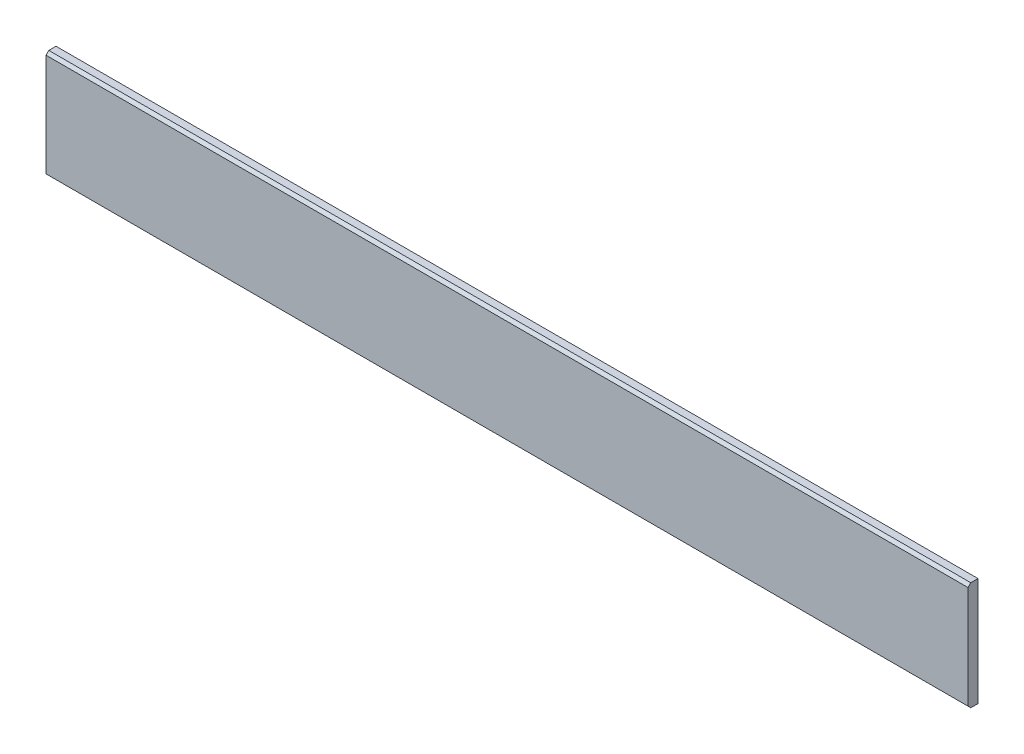
ISO-10303-21;
HEADER;
FILE_DESCRIPTION(('STEP AP214'),'2;1');
FILE_NAME('part.step','',(''),(''),'','','');
FILE_SCHEMA(('AUTOMOTIVE_DESIGN { 1 0 10303 214 1 1 1 1 }'));
ENDSEC;
DATA;
#1=APPLICATION_CONTEXT('core data for automotive mechanical design processes');
#2=APPLICATION_PROTOCOL_DEFINITION('international standard','automotive_design',2000,#1);
#3=PRODUCT_CONTEXT('',#1,'mechanical');
#4=PRODUCT('Part','Part','',(#3));
#5=PRODUCT_RELATED_PRODUCT_CATEGORY('part','',(#4));
#6=PRODUCT_DEFINITION_FORMATION('','',#4);
#7=PRODUCT_DEFINITION_CONTEXT('part definition',#1,'design');
#8=PRODUCT_DEFINITION('design','',#6,#7);
#9=PRODUCT_DEFINITION_SHAPE('','',#8);
#10=(LENGTH_UNIT() NAMED_UNIT(*) SI_UNIT(.MILLI.,.METRE.));
#11=(NAMED_UNIT(*) PLANE_ANGLE_UNIT() SI_UNIT($,.RADIAN.));
#12=(NAMED_UNIT(*) SI_UNIT($,.STERADIAN.) SOLID_ANGLE_UNIT());
#13=UNCERTAINTY_MEASURE_WITH_UNIT(LENGTH_MEASURE(1.E-05),#10,'distance_accuracy_value','');
#14=(GEOMETRIC_REPRESENTATION_CONTEXT(3) GLOBAL_UNCERTAINTY_ASSIGNED_CONTEXT((#13)) GLOBAL_UNIT_ASSIGNED_CONTEXT((#10,
#11,#12)) REPRESENTATION_CONTEXT('',''));
#15=CARTESIAN_POINT('',(0.,0.,0.));
#16=DIRECTION('',(0.,0.,1.));
#17=DIRECTION('',(1.,0.,0.));
#18=AXIS2_PLACEMENT_3D('',#15,#16,#17);
#19=CARTESIAN_POINT('',(830.,97.5,18.));
#20=DIRECTION('',(-1.,0.,0.));
#21=DIRECTION('',(0.,-1.,0.));
#22=AXIS2_PLACEMENT_3D('',#19,#20,#21);
#23=PLANE('',#22);
#24=DIRECTION('',(0.,1.,0.));
#25=VECTOR('',#24,1.);
#26=CARTESIAN_POINT('',(830.,97.5,18.));
#27=LINE('',#26,#25);
#28=CARTESIAN_POINT('',(830.,-92.4999999999999,18.));
#29=VERTEX_POINT('',#28);
#30=CARTESIAN_POINT('',(830.,92.4999999999999,18.));
#31=VERTEX_POINT('',#30);
#32=EDGE_CURVE('E119',#29,#31,#27,.T.);
#33=ORIENTED_EDGE('',*,*,#32,.F.);
#34=DIRECTION('',(0.,-0.707106781186548,-0.707106781186548));
#35=VECTOR('',#34,1.);
#36=CARTESIAN_POINT('',(830.,-92.5000000000001,17.9999999999998));
#37=LINE('',#36,#35);
#38=CARTESIAN_POINT('',(830.,-97.5,12.9999999999999));
#39=VERTEX_POINT('',#38);
#40=EDGE_CURVE('E131',#29,#39,#37,.T.);
#41=ORIENTED_EDGE('',*,*,#40,.T.);
#42=DIRECTION('',(0.,0.,-1.));
#43=VECTOR('',#42,1.);
#44=CARTESIAN_POINT('',(830.,-97.5,18.));
#45=LINE('',#44,#43);
#46=CARTESIAN_POINT('',(830.,-97.5,0.));
#47=VERTEX_POINT('',#46);
#48=EDGE_CURVE('E109',#39,#47,#45,.T.);
#49=ORIENTED_EDGE('',*,*,#48,.T.);
#50=DIRECTION('',(0.,1.,0.));
#51=VECTOR('',#50,1.);
#52=CARTESIAN_POINT('',(830.,97.5,0.));
#53=LINE('',#52,#51);
#54=CARTESIAN_POINT('',(830.,97.5,0.));
#55=VERTEX_POINT('',#54);
#56=EDGE_CURVE('E104',#47,#55,#53,.T.);
#57=ORIENTED_EDGE('',*,*,#56,.T.);
#58=DIRECTION('',(0.,0.,-1.));
#59=VECTOR('',#58,1.);
#60=CARTESIAN_POINT('',(830.,97.5,18.));
#61=LINE('',#60,#59);
#62=CARTESIAN_POINT('',(830.,97.5,12.9999999999999));
#63=VERTEX_POINT('',#62);
#64=EDGE_CURVE('E88',#63,#55,#61,.T.);
#65=ORIENTED_EDGE('',*,*,#64,.F.);
#66=DIRECTION('',(0.,-0.707106781186548,0.707106781186548));
#67=VECTOR('',#66,1.);
#68=CARTESIAN_POINT('',(830.,92.4999999999997,18.0000000000002));
#69=LINE('',#68,#67);
#70=EDGE_CURVE('E129',#63,#31,#69,.T.);
#71=ORIENTED_EDGE('',*,*,#70,.T.);
#72=EDGE_LOOP('',(#33,#41,#49,#57,#65,#71));
#73=FACE_BOUND('',#72,.T.);
#74=ADVANCED_FACE('F35',(#73),#23,.F.);
#75=CARTESIAN_POINT('',(-830.,97.5,18.));
#76=DIRECTION('',(0.,-1.,0.));
#77=DIRECTION('',(0.,0.,-1.));
#78=AXIS2_PLACEMENT_3D('',#75,#76,#77);
#79=PLANE('',#78);
#80=DIRECTION('',(0.,0.,-1.));
#81=VECTOR('',#80,1.);
#82=CARTESIAN_POINT('',(-830.,97.5,18.));
#83=LINE('',#82,#81);
#84=CARTESIAN_POINT('',(-830.,97.5,12.9999999999999));
#85=VERTEX_POINT('',#84);
#86=CARTESIAN_POINT('',(-830.,97.5,0.));
#87=VERTEX_POINT('',#86);
#88=EDGE_CURVE('E98',#85,#87,#83,.T.);
#89=ORIENTED_EDGE('',*,*,#88,.F.);
#90=DIRECTION('',(1.,0.,0.));
#91=VECTOR('',#90,1.);
#92=CARTESIAN_POINT('',(830.,97.5,12.9999999999999));
#93=LINE('',#92,#91);
#94=EDGE_CURVE('E11',#85,#63,#93,.T.);
#95=ORIENTED_EDGE('',*,*,#94,.T.);
#96=ORIENTED_EDGE('',*,*,#64,.T.);
#97=DIRECTION('',(-1.,0.,0.));
#98=VECTOR('',#97,1.);
#99=CARTESIAN_POINT('',(-830.,97.5,0.));
#100=LINE('',#99,#98);
#101=EDGE_CURVE('E91',#55,#87,#100,.T.);
#102=ORIENTED_EDGE('',*,*,#101,.T.);
#103=EDGE_LOOP('',(#89,#95,#96,#102));
#104=FACE_BOUND('',#103,.T.);
#105=ADVANCED_FACE('F90',(#104),#79,.F.);
#106=CARTESIAN_POINT('',(-830.,97.5,18.));
#107=DIRECTION('',(1.,0.,0.));
#108=DIRECTION('',(0.,1.,0.));
#109=AXIS2_PLACEMENT_3D('',#106,#107,#108);
#110=PLANE('',#109);
#111=DIRECTION('',(0.,0.,-1.));
#112=VECTOR('',#111,1.);
#113=CARTESIAN_POINT('',(-830.,-97.5,18.));
#114=LINE('',#113,#112);
#115=CARTESIAN_POINT('',(-830.,-97.5,12.9999999999999));
#116=VERTEX_POINT('',#115);
#117=CARTESIAN_POINT('',(-830.,-97.5,0.));
#118=VERTEX_POINT('',#117);
#119=EDGE_CURVE('E121',#116,#118,#114,.T.);
#120=ORIENTED_EDGE('',*,*,#119,.F.);
#121=DIRECTION('',(0.,0.707106781186548,0.707106781186548));
#122=VECTOR('',#121,1.);
#123=CARTESIAN_POINT('',(-830.,-92.4999999999996,18.0000000000002));
#124=LINE('',#123,#122);
#125=CARTESIAN_POINT('',(-830.,-92.4999999999999,18.));
#126=VERTEX_POINT('',#125);
#127=EDGE_CURVE('E43',#116,#126,#124,.T.);
#128=ORIENTED_EDGE('',*,*,#127,.T.);
#129=DIRECTION('',(0.,-1.,0.));
#130=VECTOR('',#129,1.);
#131=CARTESIAN_POINT('',(-830.,97.5,18.));
#132=LINE('',#131,#130);
#133=CARTESIAN_POINT('',(-830.,92.4999999999999,18.));
#134=VERTEX_POINT('',#133);
#135=EDGE_CURVE('E113',#134,#126,#132,.T.);
#136=ORIENTED_EDGE('',*,*,#135,.F.);
#137=DIRECTION('',(0.,0.707106781186548,-0.707106781186548));
#138=VECTOR('',#137,1.);
#139=CARTESIAN_POINT('',(-830.,92.5000000000001,17.9999999999998));
#140=LINE('',#139,#138);
#141=EDGE_CURVE('E50',#134,#85,#140,.T.);
#142=ORIENTED_EDGE('',*,*,#141,.T.);
#143=ORIENTED_EDGE('',*,*,#88,.T.);
#144=DIRECTION('',(0.,-1.,0.));
#145=VECTOR('',#144,1.);
#146=CARTESIAN_POINT('',(-830.,97.5,0.));
#147=LINE('',#146,#145);
#148=EDGE_CURVE('E106',#87,#118,#147,.T.);
#149=ORIENTED_EDGE('',*,*,#148,.T.);
#150=EDGE_LOOP('',(#120,#128,#136,#142,#143,#149));
#151=FACE_BOUND('',#150,.T.);
#152=ADVANCED_FACE('F136',(#151),#110,.F.);
#153=CARTESIAN_POINT('',(-830.,-97.5,18.));
#154=DIRECTION('',(0.,1.,0.));
#155=DIRECTION('',(0.,0.,1.));
#156=AXIS2_PLACEMENT_3D('',#153,#154,#155);
#157=PLANE('',#156);
#158=ORIENTED_EDGE('',*,*,#48,.F.);
#159=DIRECTION('',(-1.,0.,0.));
#160=VECTOR('',#159,1.);
#161=CARTESIAN_POINT('',(-830.,-97.5,12.9999999999999));
#162=LINE('',#161,#160);
#163=EDGE_CURVE('E58',#39,#116,#162,.T.);
#164=ORIENTED_EDGE('',*,*,#163,.T.);
#165=ORIENTED_EDGE('',*,*,#119,.T.);
#166=DIRECTION('',(1.,0.,0.));
#167=VECTOR('',#166,1.);
#168=CARTESIAN_POINT('',(-830.,-97.5,0.));
#169=LINE('',#168,#167);
#170=EDGE_CURVE('E117',#118,#47,#169,.T.);
#171=ORIENTED_EDGE('',*,*,#170,.T.);
#172=EDGE_LOOP('',(#158,#164,#165,#171));
#173=FACE_BOUND('',#172,.T.);
#174=ADVANCED_FACE('F144',(#173),#157,.F.);
#175=CARTESIAN_POINT('',(0.,0.,18.));
#176=DIRECTION('',(0.,0.,1.));
#177=DIRECTION('',(1.,0.,0.));
#178=AXIS2_PLACEMENT_3D('',#175,#176,#177);
#179=PLANE('',#178);
#180=ORIENTED_EDGE('',*,*,#135,.T.);
#181=DIRECTION('',(1.,0.,0.));
#182=VECTOR('',#181,1.);
#183=CARTESIAN_POINT('',(830.,-92.4999999999999,18.));
#184=LINE('',#183,#182);
#185=EDGE_CURVE('E126',#126,#29,#184,.T.);
#186=ORIENTED_EDGE('',*,*,#185,.T.);
#187=ORIENTED_EDGE('',*,*,#32,.T.);
#188=DIRECTION('',(-1.,0.,0.));
#189=VECTOR('',#188,1.);
#190=CARTESIAN_POINT('',(-830.,92.4999999999999,18.));
#191=LINE('',#190,#189);
#192=EDGE_CURVE('E97',#31,#134,#191,.T.);
#193=ORIENTED_EDGE('',*,*,#192,.T.);
#194=EDGE_LOOP('',(#180,#186,#187,#193));
#195=FACE_BOUND('',#194,.T.);
#196=ADVANCED_FACE('F140',(#195),#179,.T.);
#197=CARTESIAN_POINT('',(0.,0.,0.));
#198=DIRECTION('',(0.,0.,1.));
#199=DIRECTION('',(1.,0.,0.));
#200=AXIS2_PLACEMENT_3D('',#197,#198,#199);
#201=PLANE('',#200);
#202=ORIENTED_EDGE('',*,*,#56,.F.);
#203=ORIENTED_EDGE('',*,*,#170,.F.);
#204=ORIENTED_EDGE('',*,*,#148,.F.);
#205=ORIENTED_EDGE('',*,*,#101,.F.);
#206=EDGE_LOOP('',(#202,#203,#204,#205));
#207=FACE_BOUND('',#206,.T.);
#208=ADVANCED_FACE('F102',(#207),#201,.F.);
#209=CARTESIAN_POINT('',(0.,-92.4999999999999,18.));
#210=DIRECTION('',(0.,-0.707106781186548,0.707106781186548));
#211=DIRECTION('',(-1.,0.,0.));
#212=AXIS2_PLACEMENT_3D('',#209,#210,#211);
#213=PLANE('',#212);
#214=ORIENTED_EDGE('',*,*,#127,.F.);
#215=ORIENTED_EDGE('',*,*,#163,.F.);
#216=ORIENTED_EDGE('',*,*,#40,.F.);
#217=ORIENTED_EDGE('',*,*,#185,.F.);
#218=EDGE_LOOP('',(#214,#215,#216,#217));
#219=FACE_BOUND('',#218,.T.);
#220=ADVANCED_FACE('F143',(#219),#213,.T.);
#221=CARTESIAN_POINT('',(0.,92.4999999999999,18.));
#222=DIRECTION('',(0.,0.707106781186548,0.707106781186548));
#223=DIRECTION('',(1.,0.,0.));
#224=AXIS2_PLACEMENT_3D('',#221,#222,#223);
#225=PLANE('',#224);
#226=ORIENTED_EDGE('',*,*,#70,.F.);
#227=ORIENTED_EDGE('',*,*,#94,.F.);
#228=ORIENTED_EDGE('',*,*,#141,.F.);
#229=ORIENTED_EDGE('',*,*,#192,.F.);
#230=EDGE_LOOP('',(#226,#227,#228,#229));
#231=FACE_BOUND('',#230,.T.);
#232=ADVANCED_FACE('F37',(#231),#225,.T.);
#233=CLOSED_SHELL('',(#74,#105,#152,#174,#196,#208,#220,#232));
#234=MANIFOLD_SOLID_BREP('B2',#233);
#235=ADVANCED_BREP_SHAPE_REPRESENTATION('',(#18,#234),#14);
#236=SHAPE_DEFINITION_REPRESENTATION(#9,#235);
ENDSEC;
END-ISO-10303-21;
